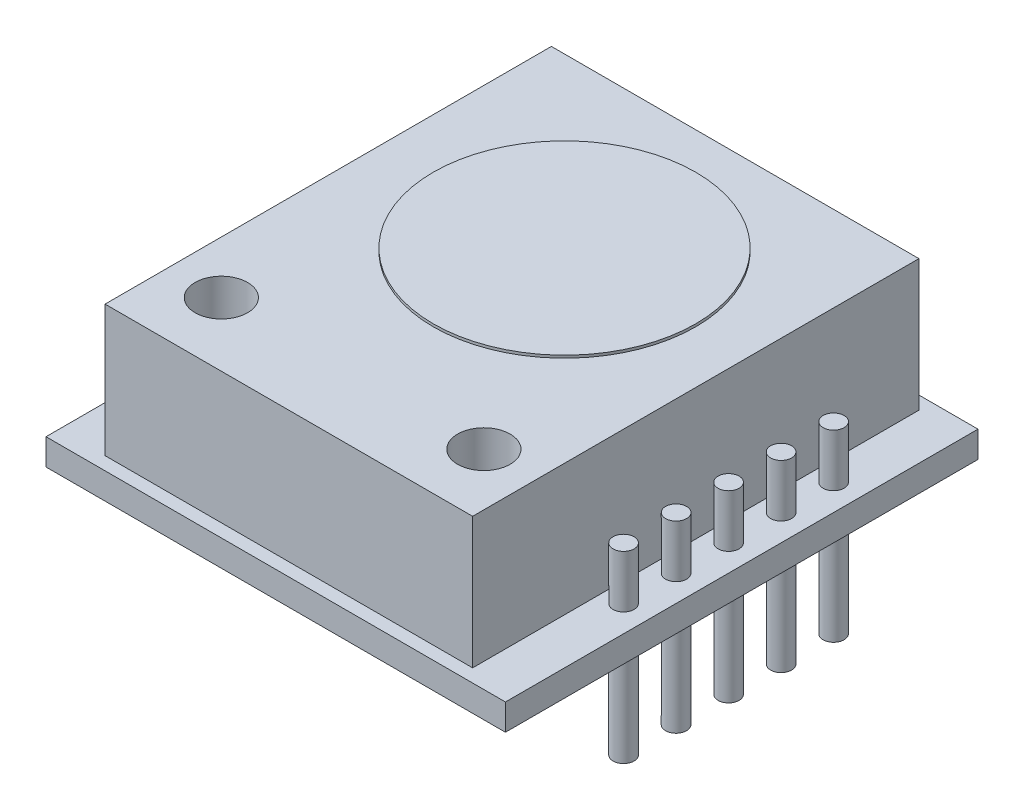
ISO-10303-21;
HEADER;
FILE_DESCRIPTION(('STEP AP214'),'2;1');
FILE_NAME('part.step','',(''),(''),'','','');
FILE_SCHEMA(('AUTOMOTIVE_DESIGN { 1 0 10303 214 1 1 1 1 }'));
ENDSEC;
DATA;
#1=APPLICATION_CONTEXT('core data for automotive mechanical design processes');
#2=APPLICATION_PROTOCOL_DEFINITION('international standard','automotive_design',2000,#1);
#3=PRODUCT_CONTEXT('',#1,'mechanical');
#4=PRODUCT('Part','Part','',(#3));
#5=PRODUCT_RELATED_PRODUCT_CATEGORY('part','',(#4));
#6=PRODUCT_DEFINITION_FORMATION('','',#4);
#7=PRODUCT_DEFINITION_CONTEXT('part definition',#1,'design');
#8=PRODUCT_DEFINITION('design','',#6,#7);
#9=PRODUCT_DEFINITION_SHAPE('','',#8);
#10=(LENGTH_UNIT() NAMED_UNIT(*) SI_UNIT(.MILLI.,.METRE.));
#11=(NAMED_UNIT(*) PLANE_ANGLE_UNIT() SI_UNIT($,.RADIAN.));
#12=(NAMED_UNIT(*) SI_UNIT($,.STERADIAN.) SOLID_ANGLE_UNIT());
#13=UNCERTAINTY_MEASURE_WITH_UNIT(LENGTH_MEASURE(1.E-05),#10,'distance_accuracy_value','');
#14=(GEOMETRIC_REPRESENTATION_CONTEXT(3) GLOBAL_UNCERTAINTY_ASSIGNED_CONTEXT((#13)) GLOBAL_UNIT_ASSIGNED_CONTEXT((#10,
#11,#12)) REPRESENTATION_CONTEXT('',''));
#15=CARTESIAN_POINT('',(0.,0.,0.));
#16=DIRECTION('',(0.,0.,1.));
#17=DIRECTION('',(1.,0.,0.));
#18=AXIS2_PLACEMENT_3D('',#15,#16,#17);
#19=CARTESIAN_POINT('',(0.,1.,0.));
#20=DIRECTION('',(0.,-1.,0.));
#21=DIRECTION('',(0.,0.,-1.));
#22=AXIS2_PLACEMENT_3D('',#19,#20,#21);
#23=PLANE('',#22);
#24=CARTESIAN_POINT('',(7.75000000000008,1.,3.5));
#25=DIRECTION('',(0.,-1.,0.));
#26=DIRECTION('',(0.,0.,-1.));
#27=AXIS2_PLACEMENT_3D('',#24,#25,#26);
#28=CIRCLE('',#27,0.4);
#29=CARTESIAN_POINT('',(7.75000000000008,1.,3.1));
#30=VERTEX_POINT('',#29);
#31=EDGE_CURVE('E714',#30,#30,#28,.T.);
#32=ORIENTED_EDGE('',*,*,#31,.T.);
#33=EDGE_LOOP('',(#32));
#34=FACE_BOUND('',#33,.T.);
#35=CARTESIAN_POINT('',(7.75000000000006,1.,1.5));
#36=DIRECTION('',(0.,-1.,0.));
#37=DIRECTION('',(0.,0.,-1.));
#38=AXIS2_PLACEMENT_3D('',#35,#36,#37);
#39=CIRCLE('',#38,0.4);
#40=CARTESIAN_POINT('',(7.75000000000006,1.,1.1));
#41=VERTEX_POINT('',#40);
#42=EDGE_CURVE('E722',#41,#41,#39,.T.);
#43=ORIENTED_EDGE('',*,*,#42,.T.);
#44=EDGE_LOOP('',(#43));
#45=FACE_BOUND('',#44,.T.);
#46=CARTESIAN_POINT('',(7.75000000000004,1.,-0.5));
#47=DIRECTION('',(0.,-1.,0.));
#48=DIRECTION('',(0.,0.,-1.));
#49=AXIS2_PLACEMENT_3D('',#46,#47,#48);
#50=CIRCLE('',#49,0.4);
#51=CARTESIAN_POINT('',(7.75000000000004,1.,-0.900000000000001));
#52=VERTEX_POINT('',#51);
#53=EDGE_CURVE('E731',#52,#52,#50,.T.);
#54=ORIENTED_EDGE('',*,*,#53,.T.);
#55=EDGE_LOOP('',(#54));
#56=FACE_BOUND('',#55,.T.);
#57=CARTESIAN_POINT('',(7.75000000000002,1.,-2.5));
#58=DIRECTION('',(0.,-1.,0.));
#59=DIRECTION('',(0.,0.,-1.));
#60=AXIS2_PLACEMENT_3D('',#57,#58,#59);
#61=CIRCLE('',#60,0.4);
#62=CARTESIAN_POINT('',(7.75000000000002,1.,-2.9));
#63=VERTEX_POINT('',#62);
#64=EDGE_CURVE('E740',#63,#63,#61,.T.);
#65=ORIENTED_EDGE('',*,*,#64,.T.);
#66=EDGE_LOOP('',(#65));
#67=FACE_BOUND('',#66,.T.);
#68=CARTESIAN_POINT('',(7.75,1.,-4.5));
#69=DIRECTION('',(0.,-1.,0.));
#70=DIRECTION('',(0.,0.,-1.));
#71=AXIS2_PLACEMENT_3D('',#68,#69,#70);
#72=CIRCLE('',#71,0.4);
#73=CARTESIAN_POINT('',(7.75,1.,-4.9));
#74=VERTEX_POINT('',#73);
#75=EDGE_CURVE('E279',#74,#74,#72,.T.);
#76=ORIENTED_EDGE('',*,*,#75,.T.);
#77=EDGE_LOOP('',(#76));
#78=FACE_BOUND('',#77,.T.);
#79=DIRECTION('',(0.,0.,-1.));
#80=VECTOR('',#79,1.);
#81=CARTESIAN_POINT('',(7.,1.,8.5));
#82=LINE('',#81,#80);
#83=CARTESIAN_POINT('',(7.,1.,8.5));
#84=VERTEX_POINT('',#83);
#85=CARTESIAN_POINT('',(7.,1.,-8.5));
#86=VERTEX_POINT('',#85);
#87=EDGE_CURVE('E51',#84,#86,#82,.T.);
#88=ORIENTED_EDGE('',*,*,#87,.F.);
#89=DIRECTION('',(1.,0.,0.));
#90=VECTOR('',#89,1.);
#91=CARTESIAN_POINT('',(-7.,1.,8.5));
#92=LINE('',#91,#90);
#93=CARTESIAN_POINT('',(-7.,1.,8.5));
#94=VERTEX_POINT('',#93);
#95=EDGE_CURVE('E55',#94,#84,#92,.T.);
#96=ORIENTED_EDGE('',*,*,#95,.F.);
#97=DIRECTION('',(0.,0.,1.));
#98=VECTOR('',#97,1.);
#99=CARTESIAN_POINT('',(-7.,1.,8.5));
#100=LINE('',#99,#98);
#101=CARTESIAN_POINT('',(-7.,1.,-8.5));
#102=VERTEX_POINT('',#101);
#103=EDGE_CURVE('E299',#102,#94,#100,.T.);
#104=ORIENTED_EDGE('',*,*,#103,.F.);
#105=DIRECTION('',(-1.,0.,0.));
#106=VECTOR('',#105,1.);
#107=CARTESIAN_POINT('',(-7.,1.,-8.5));
#108=LINE('',#107,#106);
#109=EDGE_CURVE('E297',#86,#102,#108,.T.);
#110=ORIENTED_EDGE('',*,*,#109,.F.);
#111=EDGE_LOOP('',(#88,#96,#104,#110));
#112=FACE_BOUND('',#111,.T.);
#113=DIRECTION('',(0.,0.,-1.));
#114=VECTOR('',#113,1.);
#115=CARTESIAN_POINT('',(8.75,1.,9.));
#116=LINE('',#115,#114);
#117=CARTESIAN_POINT('',(8.75,1.,9.));
#118=VERTEX_POINT('',#117);
#119=CARTESIAN_POINT('',(8.75,1.,-9.));
#120=VERTEX_POINT('',#119);
#121=EDGE_CURVE('E164',#118,#120,#116,.T.);
#122=ORIENTED_EDGE('',*,*,#121,.T.);
#123=DIRECTION('',(-1.,0.,0.));
#124=VECTOR('',#123,1.);
#125=CARTESIAN_POINT('',(-8.75,1.,-9.));
#126=LINE('',#125,#124);
#127=CARTESIAN_POINT('',(-8.75,1.,-9.));
#128=VERTEX_POINT('',#127);
#129=EDGE_CURVE('E167',#120,#128,#126,.T.);
#130=ORIENTED_EDGE('',*,*,#129,.T.);
#131=DIRECTION('',(0.,0.,1.));
#132=VECTOR('',#131,1.);
#133=CARTESIAN_POINT('',(-8.75,1.,9.));
#134=LINE('',#133,#132);
#135=CARTESIAN_POINT('',(-8.75,1.,9.));
#136=VERTEX_POINT('',#135);
#137=EDGE_CURVE('E170',#128,#136,#134,.T.);
#138=ORIENTED_EDGE('',*,*,#137,.T.);
#139=DIRECTION('',(1.,0.,0.));
#140=VECTOR('',#139,1.);
#141=CARTESIAN_POINT('',(-8.75,1.,9.));
#142=LINE('',#141,#140);
#143=EDGE_CURVE('E172',#136,#118,#142,.T.);
#144=ORIENTED_EDGE('',*,*,#143,.T.);
#145=EDGE_LOOP('',(#122,#130,#138,#144));
#146=FACE_BOUND('',#145,.T.);
#147=CARTESIAN_POINT('',(-7.95,1.,5.1));
#148=DIRECTION('',(0.,1.,0.));
#149=DIRECTION('',(0.,0.,1.));
#150=AXIS2_PLACEMENT_3D('',#147,#148,#149);
#151=CIRCLE('',#150,0.4);
#152=CARTESIAN_POINT('',(-7.95,1.,5.5));
#153=VERTEX_POINT('',#152);
#154=EDGE_CURVE('E158',#153,#153,#151,.T.);
#155=ORIENTED_EDGE('',*,*,#154,.F.);
#156=EDGE_LOOP('',(#155));
#157=FACE_BOUND('',#156,.T.);
#158=CARTESIAN_POINT('',(-7.95000000000001,1.,3.1));
#159=DIRECTION('',(0.,1.,0.));
#160=DIRECTION('',(0.,0.,1.));
#161=AXIS2_PLACEMENT_3D('',#158,#159,#160);
#162=CIRCLE('',#161,0.4);
#163=CARTESIAN_POINT('',(-7.95000000000001,1.,3.5));
#164=VERTEX_POINT('',#163);
#165=EDGE_CURVE('E152',#164,#164,#162,.T.);
#166=ORIENTED_EDGE('',*,*,#165,.F.);
#167=EDGE_LOOP('',(#166));
#168=FACE_BOUND('',#167,.T.);
#169=CARTESIAN_POINT('',(-7.95000000000001,1.,1.1));
#170=DIRECTION('',(0.,1.,0.));
#171=DIRECTION('',(0.,0.,1.));
#172=AXIS2_PLACEMENT_3D('',#169,#170,#171);
#173=CIRCLE('',#172,0.4);
#174=CARTESIAN_POINT('',(-7.95000000000001,1.,1.5));
#175=VERTEX_POINT('',#174);
#176=EDGE_CURVE('E146',#175,#175,#173,.T.);
#177=ORIENTED_EDGE('',*,*,#176,.F.);
#178=EDGE_LOOP('',(#177));
#179=FACE_BOUND('',#178,.T.);
#180=CARTESIAN_POINT('',(-7.95000000000002,1.,-0.900000000000002));
#181=DIRECTION('',(0.,1.,0.));
#182=DIRECTION('',(0.,0.,1.));
#183=AXIS2_PLACEMENT_3D('',#180,#181,#182);
#184=CIRCLE('',#183,0.4);
#185=CARTESIAN_POINT('',(-7.95000000000002,1.,-0.500000000000003));
#186=VERTEX_POINT('',#185);
#187=EDGE_CURVE('E140',#186,#186,#184,.T.);
#188=ORIENTED_EDGE('',*,*,#187,.F.);
#189=EDGE_LOOP('',(#188));
#190=FACE_BOUND('',#189,.T.);
#191=CARTESIAN_POINT('',(-7.95000000000003,1.,-2.9));
#192=DIRECTION('',(0.,1.,0.));
#193=DIRECTION('',(0.,0.,1.));
#194=AXIS2_PLACEMENT_3D('',#191,#192,#193);
#195=CIRCLE('',#194,0.4);
#196=CARTESIAN_POINT('',(-7.95000000000003,1.,-2.5));
#197=VERTEX_POINT('',#196);
#198=EDGE_CURVE('E134',#197,#197,#195,.T.);
#199=ORIENTED_EDGE('',*,*,#198,.F.);
#200=EDGE_LOOP('',(#199));
#201=FACE_BOUND('',#200,.T.);
#202=CARTESIAN_POINT('',(-7.95000000000003,1.,-4.9));
#203=DIRECTION('',(0.,1.,0.));
#204=DIRECTION('',(0.,0.,1.));
#205=AXIS2_PLACEMENT_3D('',#202,#203,#204);
#206=CIRCLE('',#205,0.4);
#207=CARTESIAN_POINT('',(-7.95000000000003,1.,-4.5));
#208=VERTEX_POINT('',#207);
#209=EDGE_CURVE('E125',#208,#208,#206,.T.);
#210=ORIENTED_EDGE('',*,*,#209,.F.);
#211=EDGE_LOOP('',(#210));
#212=FACE_BOUND('',#211,.T.);
#213=ADVANCED_FACE('F35',(#34,#45,#56,#67,#78,#112,#146,#157,#168,#179,#190,#201,#212),#23,.F.);
#214=CARTESIAN_POINT('',(0.,0.,0.));
#215=DIRECTION('',(0.,-1.,0.));
#216=DIRECTION('',(0.,0.,-1.));
#217=AXIS2_PLACEMENT_3D('',#214,#215,#216);
#218=PLANE('',#217);
#219=CARTESIAN_POINT('',(7.75000000000008,0.,3.5));
#220=DIRECTION('',(0.,-1.,0.));
#221=DIRECTION('',(0.,0.,-1.));
#222=AXIS2_PLACEMENT_3D('',#219,#220,#221);
#223=CIRCLE('',#222,0.4);
#224=CARTESIAN_POINT('',(7.75000000000008,0.,3.1));
#225=VERTEX_POINT('',#224);
#226=EDGE_CURVE('E39',#225,#225,#223,.T.);
#227=ORIENTED_EDGE('',*,*,#226,.F.);
#228=EDGE_LOOP('',(#227));
#229=FACE_BOUND('',#228,.T.);
#230=CARTESIAN_POINT('',(7.75000000000006,0.,1.5));
#231=DIRECTION('',(0.,-1.,0.));
#232=DIRECTION('',(0.,0.,-1.));
#233=AXIS2_PLACEMENT_3D('',#230,#231,#232);
#234=CIRCLE('',#233,0.4);
#235=CARTESIAN_POINT('',(7.75000000000006,0.,1.1));
#236=VERTEX_POINT('',#235);
#237=EDGE_CURVE('E201',#236,#236,#234,.T.);
#238=ORIENTED_EDGE('',*,*,#237,.F.);
#239=EDGE_LOOP('',(#238));
#240=FACE_BOUND('',#239,.T.);
#241=CARTESIAN_POINT('',(7.75000000000004,0.,-0.5));
#242=DIRECTION('',(0.,-1.,0.));
#243=DIRECTION('',(0.,0.,-1.));
#244=AXIS2_PLACEMENT_3D('',#241,#242,#243);
#245=CIRCLE('',#244,0.4);
#246=CARTESIAN_POINT('',(7.75000000000004,0.,-0.900000000000001));
#247=VERTEX_POINT('',#246);
#248=EDGE_CURVE('E199',#247,#247,#245,.T.);
#249=ORIENTED_EDGE('',*,*,#248,.F.);
#250=EDGE_LOOP('',(#249));
#251=FACE_BOUND('',#250,.T.);
#252=CARTESIAN_POINT('',(7.75000000000002,0.,-2.5));
#253=DIRECTION('',(0.,-1.,0.));
#254=DIRECTION('',(0.,0.,-1.));
#255=AXIS2_PLACEMENT_3D('',#252,#253,#254);
#256=CIRCLE('',#255,0.4);
#257=CARTESIAN_POINT('',(7.75000000000002,0.,-2.9));
#258=VERTEX_POINT('',#257);
#259=EDGE_CURVE('E196',#258,#258,#256,.T.);
#260=ORIENTED_EDGE('',*,*,#259,.F.);
#261=EDGE_LOOP('',(#260));
#262=FACE_BOUND('',#261,.T.);
#263=CARTESIAN_POINT('',(7.75,0.,-4.5));
#264=DIRECTION('',(0.,-1.,0.));
#265=DIRECTION('',(0.,0.,-1.));
#266=AXIS2_PLACEMENT_3D('',#263,#264,#265);
#267=CIRCLE('',#266,0.4);
#268=CARTESIAN_POINT('',(7.75,0.,-4.9));
#269=VERTEX_POINT('',#268);
#270=EDGE_CURVE('E193',#269,#269,#267,.T.);
#271=ORIENTED_EDGE('',*,*,#270,.F.);
#272=EDGE_LOOP('',(#271));
#273=FACE_BOUND('',#272,.T.);
#274=CARTESIAN_POINT('',(-7.95000000000003,0.,-2.9));
#275=DIRECTION('',(0.,1.,0.));
#276=DIRECTION('',(0.,0.,1.));
#277=AXIS2_PLACEMENT_3D('',#274,#275,#276);
#278=CIRCLE('',#277,0.4);
#279=CARTESIAN_POINT('',(-7.95000000000003,0.,-2.5));
#280=VERTEX_POINT('',#279);
#281=EDGE_CURVE('E132',#280,#280,#278,.T.);
#282=ORIENTED_EDGE('',*,*,#281,.T.);
#283=EDGE_LOOP('',(#282));
#284=FACE_BOUND('',#283,.T.);
#285=CARTESIAN_POINT('',(-7.95000000000001,0.,1.1));
#286=DIRECTION('',(0.,1.,0.));
#287=DIRECTION('',(0.,0.,1.));
#288=AXIS2_PLACEMENT_3D('',#285,#286,#287);
#289=CIRCLE('',#288,0.4);
#290=CARTESIAN_POINT('',(-7.95000000000001,0.,1.5));
#291=VERTEX_POINT('',#290);
#292=EDGE_CURVE('E143',#291,#291,#289,.T.);
#293=ORIENTED_EDGE('',*,*,#292,.T.);
#294=EDGE_LOOP('',(#293));
#295=FACE_BOUND('',#294,.T.);
#296=CARTESIAN_POINT('',(-7.95,0.,5.1));
#297=DIRECTION('',(0.,1.,0.));
#298=DIRECTION('',(0.,0.,1.));
#299=AXIS2_PLACEMENT_3D('',#296,#297,#298);
#300=CIRCLE('',#299,0.4);
#301=CARTESIAN_POINT('',(-7.95,0.,5.5));
#302=VERTEX_POINT('',#301);
#303=EDGE_CURVE('E155',#302,#302,#300,.T.);
#304=ORIENTED_EDGE('',*,*,#303,.T.);
#305=EDGE_LOOP('',(#304));
#306=FACE_BOUND('',#305,.T.);
#307=DIRECTION('',(0.,0.,-1.));
#308=VECTOR('',#307,1.);
#309=CARTESIAN_POINT('',(8.75,0.,9.));
#310=LINE('',#309,#308);
#311=CARTESIAN_POINT('',(8.75,0.,9.));
#312=VERTEX_POINT('',#311);
#313=CARTESIAN_POINT('',(8.75,0.,-9.));
#314=VERTEX_POINT('',#313);
#315=EDGE_CURVE('E161',#312,#314,#310,.T.);
#316=ORIENTED_EDGE('',*,*,#315,.F.);
#317=DIRECTION('',(1.,0.,0.));
#318=VECTOR('',#317,1.);
#319=CARTESIAN_POINT('',(-8.75,0.,9.));
#320=LINE('',#319,#318);
#321=CARTESIAN_POINT('',(-8.75,0.,9.));
#322=VERTEX_POINT('',#321);
#323=EDGE_CURVE('E168',#322,#312,#320,.T.);
#324=ORIENTED_EDGE('',*,*,#323,.F.);
#325=DIRECTION('',(0.,0.,1.));
#326=VECTOR('',#325,1.);
#327=CARTESIAN_POINT('',(-8.75,0.,9.));
#328=LINE('',#327,#326);
#329=CARTESIAN_POINT('',(-8.75,0.,-9.));
#330=VERTEX_POINT('',#329);
#331=EDGE_CURVE('E179',#330,#322,#328,.T.);
#332=ORIENTED_EDGE('',*,*,#331,.F.);
#333=DIRECTION('',(-1.,0.,0.));
#334=VECTOR('',#333,1.);
#335=CARTESIAN_POINT('',(-8.75,0.,-9.));
#336=LINE('',#335,#334);
#337=EDGE_CURVE('E177',#314,#330,#336,.T.);
#338=ORIENTED_EDGE('',*,*,#337,.F.);
#339=EDGE_LOOP('',(#316,#324,#332,#338));
#340=FACE_BOUND('',#339,.T.);
#341=CARTESIAN_POINT('',(-7.95000000000001,0.,3.1));
#342=DIRECTION('',(0.,1.,0.));
#343=DIRECTION('',(0.,0.,1.));
#344=AXIS2_PLACEMENT_3D('',#341,#342,#343);
#345=CIRCLE('',#344,0.4);
#346=CARTESIAN_POINT('',(-7.95000000000001,0.,3.5));
#347=VERTEX_POINT('',#346);
#348=EDGE_CURVE('E149',#347,#347,#345,.T.);
#349=ORIENTED_EDGE('',*,*,#348,.T.);
#350=EDGE_LOOP('',(#349));
#351=FACE_BOUND('',#350,.T.);
#352=CARTESIAN_POINT('',(-7.95000000000002,0.,-0.900000000000002));
#353=DIRECTION('',(0.,1.,0.));
#354=DIRECTION('',(0.,0.,1.));
#355=AXIS2_PLACEMENT_3D('',#352,#353,#354);
#356=CIRCLE('',#355,0.4);
#357=CARTESIAN_POINT('',(-7.95000000000002,0.,-0.500000000000003));
#358=VERTEX_POINT('',#357);
#359=EDGE_CURVE('E137',#358,#358,#356,.T.);
#360=ORIENTED_EDGE('',*,*,#359,.T.);
#361=EDGE_LOOP('',(#360));
#362=FACE_BOUND('',#361,.T.);
#363=CARTESIAN_POINT('',(-7.95000000000003,0.,-4.9));
#364=DIRECTION('',(0.,1.,0.));
#365=DIRECTION('',(0.,0.,1.));
#366=AXIS2_PLACEMENT_3D('',#363,#364,#365);
#367=CIRCLE('',#366,0.4);
#368=CARTESIAN_POINT('',(-7.95000000000003,0.,-4.5));
#369=VERTEX_POINT('',#368);
#370=EDGE_CURVE('E122',#369,#369,#367,.T.);
#371=ORIENTED_EDGE('',*,*,#370,.T.);
#372=EDGE_LOOP('',(#371));
#373=FACE_BOUND('',#372,.T.);
#374=ADVANCED_FACE('F211',(#229,#240,#251,#262,#273,#284,#295,#306,#340,#351,#362,#373),#218,.T.);
#375=CARTESIAN_POINT('',(8.75,1.,9.));
#376=DIRECTION('',(-1.,0.,0.));
#377=DIRECTION('',(0.,0.,1.));
#378=AXIS2_PLACEMENT_3D('',#375,#376,#377);
#379=PLANE('',#378);
#380=ORIENTED_EDGE('',*,*,#315,.T.);
#381=DIRECTION('',(0.,-1.,0.));
#382=VECTOR('',#381,1.);
#383=CARTESIAN_POINT('',(8.75,1.,-9.));
#384=LINE('',#383,#382);
#385=EDGE_CURVE('E190',#120,#314,#384,.T.);
#386=ORIENTED_EDGE('',*,*,#385,.F.);
#387=ORIENTED_EDGE('',*,*,#121,.F.);
#388=DIRECTION('',(0.,-1.,0.));
#389=VECTOR('',#388,1.);
#390=CARTESIAN_POINT('',(8.75,1.,9.));
#391=LINE('',#390,#389);
#392=EDGE_CURVE('E174',#118,#312,#391,.T.);
#393=ORIENTED_EDGE('',*,*,#392,.T.);
#394=EDGE_LOOP('',(#380,#386,#387,#393));
#395=FACE_BOUND('',#394,.T.);
#396=ADVANCED_FACE('F37',(#395),#379,.F.);
#397=CARTESIAN_POINT('',(-8.75,1.,-9.));
#398=DIRECTION('',(0.,0.,1.));
#399=DIRECTION('',(1.,0.,0.));
#400=AXIS2_PLACEMENT_3D('',#397,#398,#399);
#401=PLANE('',#400);
#402=ORIENTED_EDGE('',*,*,#337,.T.);
#403=DIRECTION('',(0.,-1.,0.));
#404=VECTOR('',#403,1.);
#405=CARTESIAN_POINT('',(-8.75,1.,-9.));
#406=LINE('',#405,#404);
#407=EDGE_CURVE('E187',#128,#330,#406,.T.);
#408=ORIENTED_EDGE('',*,*,#407,.F.);
#409=ORIENTED_EDGE('',*,*,#129,.F.);
#410=ORIENTED_EDGE('',*,*,#385,.T.);
#411=EDGE_LOOP('',(#402,#408,#409,#410));
#412=FACE_BOUND('',#411,.T.);
#413=ADVANCED_FACE('F352',(#412),#401,.F.);
#414=CARTESIAN_POINT('',(-8.75,1.,9.));
#415=DIRECTION('',(1.,0.,0.));
#416=DIRECTION('',(0.,0.,-1.));
#417=AXIS2_PLACEMENT_3D('',#414,#415,#416);
#418=PLANE('',#417);
#419=ORIENTED_EDGE('',*,*,#331,.T.);
#420=DIRECTION('',(0.,-1.,0.));
#421=VECTOR('',#420,1.);
#422=CARTESIAN_POINT('',(-8.75,1.,9.));
#423=LINE('',#422,#421);
#424=EDGE_CURVE('E184',#136,#322,#423,.T.);
#425=ORIENTED_EDGE('',*,*,#424,.F.);
#426=ORIENTED_EDGE('',*,*,#137,.F.);
#427=ORIENTED_EDGE('',*,*,#407,.T.);
#428=EDGE_LOOP('',(#419,#425,#426,#427));
#429=FACE_BOUND('',#428,.T.);
#430=ADVANCED_FACE('F345',(#429),#418,.F.);
#431=CARTESIAN_POINT('',(-8.75,1.,9.));
#432=DIRECTION('',(0.,0.,-1.));
#433=DIRECTION('',(-1.,0.,0.));
#434=AXIS2_PLACEMENT_3D('',#431,#432,#433);
#435=PLANE('',#434);
#436=ORIENTED_EDGE('',*,*,#323,.T.);
#437=ORIENTED_EDGE('',*,*,#392,.F.);
#438=ORIENTED_EDGE('',*,*,#143,.F.);
#439=ORIENTED_EDGE('',*,*,#424,.T.);
#440=EDGE_LOOP('',(#436,#437,#438,#439));
#441=FACE_BOUND('',#440,.T.);
#442=ADVANCED_FACE('F340',(#441),#435,.F.);
#443=CARTESIAN_POINT('',(-7.95,1.,5.1));
#444=DIRECTION('',(0.,-1.,0.));
#445=DIRECTION('',(0.,0.,-1.));
#446=AXIS2_PLACEMENT_3D('',#443,#444,#445);
#447=CYLINDRICAL_SURFACE('',#446,0.4);
#448=ORIENTED_EDGE('',*,*,#154,.T.);
#449=EDGE_LOOP('',(#448));
#450=FACE_BOUND('',#449,.T.);
#451=ORIENTED_EDGE('',*,*,#303,.F.);
#452=EDGE_LOOP('',(#451));
#453=FACE_BOUND('',#452,.T.);
#454=ADVANCED_FACE('F337',(#450,#453),#447,.F.);
#455=CARTESIAN_POINT('',(-7.95000000000001,1.,3.1));
#456=DIRECTION('',(0.,-1.,0.));
#457=DIRECTION('',(0.,0.,-1.));
#458=AXIS2_PLACEMENT_3D('',#455,#456,#457);
#459=CYLINDRICAL_SURFACE('',#458,0.4);
#460=ORIENTED_EDGE('',*,*,#165,.T.);
#461=EDGE_LOOP('',(#460));
#462=FACE_BOUND('',#461,.T.);
#463=ORIENTED_EDGE('',*,*,#348,.F.);
#464=EDGE_LOOP('',(#463));
#465=FACE_BOUND('',#464,.T.);
#466=ADVANCED_FACE('F332',(#462,#465),#459,.F.);
#467=CARTESIAN_POINT('',(-7.95000000000001,1.,1.1));
#468=DIRECTION('',(0.,-1.,0.));
#469=DIRECTION('',(0.,0.,-1.));
#470=AXIS2_PLACEMENT_3D('',#467,#468,#469);
#471=CYLINDRICAL_SURFACE('',#470,0.4);
#472=ORIENTED_EDGE('',*,*,#176,.T.);
#473=EDGE_LOOP('',(#472));
#474=FACE_BOUND('',#473,.T.);
#475=ORIENTED_EDGE('',*,*,#292,.F.);
#476=EDGE_LOOP('',(#475));
#477=FACE_BOUND('',#476,.T.);
#478=ADVANCED_FACE('F327',(#474,#477),#471,.F.);
#479=CARTESIAN_POINT('',(-7.95000000000002,1.,-0.900000000000002));
#480=DIRECTION('',(0.,-1.,0.));
#481=DIRECTION('',(0.,0.,-1.));
#482=AXIS2_PLACEMENT_3D('',#479,#480,#481);
#483=CYLINDRICAL_SURFACE('',#482,0.4);
#484=ORIENTED_EDGE('',*,*,#187,.T.);
#485=EDGE_LOOP('',(#484));
#486=FACE_BOUND('',#485,.T.);
#487=ORIENTED_EDGE('',*,*,#359,.F.);
#488=EDGE_LOOP('',(#487));
#489=FACE_BOUND('',#488,.T.);
#490=ADVANCED_FACE('F248',(#486,#489),#483,.F.);
#491=CARTESIAN_POINT('',(-7.95000000000003,1.,-2.9));
#492=DIRECTION('',(0.,-1.,0.));
#493=DIRECTION('',(0.,0.,-1.));
#494=AXIS2_PLACEMENT_3D('',#491,#492,#493);
#495=CYLINDRICAL_SURFACE('',#494,0.4);
#496=ORIENTED_EDGE('',*,*,#198,.T.);
#497=EDGE_LOOP('',(#496));
#498=FACE_BOUND('',#497,.T.);
#499=ORIENTED_EDGE('',*,*,#281,.F.);
#500=EDGE_LOOP('',(#499));
#501=FACE_BOUND('',#500,.T.);
#502=ADVANCED_FACE('F239',(#498,#501),#495,.F.);
#503=CARTESIAN_POINT('',(-7.95000000000003,1.,-4.9));
#504=DIRECTION('',(0.,-1.,0.));
#505=DIRECTION('',(0.,0.,-1.));
#506=AXIS2_PLACEMENT_3D('',#503,#504,#505);
#507=CYLINDRICAL_SURFACE('',#506,0.4);
#508=ORIENTED_EDGE('',*,*,#209,.T.);
#509=EDGE_LOOP('',(#508));
#510=FACE_BOUND('',#509,.T.);
#511=ORIENTED_EDGE('',*,*,#370,.F.);
#512=EDGE_LOOP('',(#511));
#513=FACE_BOUND('',#512,.T.);
#514=ADVANCED_FACE('F237',(#510,#513),#507,.F.);
#515=CARTESIAN_POINT('',(0.,6.,0.));
#516=DIRECTION('',(0.,-1.,0.));
#517=DIRECTION('',(0.,0.,-1.));
#518=AXIS2_PLACEMENT_3D('',#515,#516,#517);
#519=PLANE('',#518);
#520=CARTESIAN_POINT('',(0.,6.,-2.));
#521=DIRECTION('',(0.,1.,0.));
#522=DIRECTION('',(0.,0.,1.));
#523=AXIS2_PLACEMENT_3D('',#520,#521,#522);
#524=CIRCLE('',#523,5.);
#525=CARTESIAN_POINT('',(0.,6.,3.));
#526=VERTEX_POINT('',#525);
#527=EDGE_CURVE('E11',#526,#526,#524,.T.);
#528=ORIENTED_EDGE('',*,*,#527,.F.);
#529=EDGE_LOOP('',(#528));
#530=FACE_BOUND('',#529,.T.);
#531=DIRECTION('',(0.,0.,-1.));
#532=VECTOR('',#531,1.);
#533=CARTESIAN_POINT('',(7.,6.,8.5));
#534=LINE('',#533,#532);
#535=CARTESIAN_POINT('',(7.,6.,8.5));
#536=VERTEX_POINT('',#535);
#537=CARTESIAN_POINT('',(7.,6.,-8.5));
#538=VERTEX_POINT('',#537);
#539=EDGE_CURVE('E110',#536,#538,#534,.T.);
#540=ORIENTED_EDGE('',*,*,#539,.T.);
#541=DIRECTION('',(-1.,0.,0.));
#542=VECTOR('',#541,1.);
#543=CARTESIAN_POINT('',(-7.,6.,-8.5));
#544=LINE('',#543,#542);
#545=CARTESIAN_POINT('',(-7.,6.,-8.5));
#546=VERTEX_POINT('',#545);
#547=EDGE_CURVE('E99',#538,#546,#544,.T.);
#548=ORIENTED_EDGE('',*,*,#547,.T.);
#549=DIRECTION('',(0.,0.,1.));
#550=VECTOR('',#549,1.);
#551=CARTESIAN_POINT('',(-7.,6.,8.5));
#552=LINE('',#551,#550);
#553=CARTESIAN_POINT('',(-7.,6.,8.5));
#554=VERTEX_POINT('',#553);
#555=EDGE_CURVE('E109',#546,#554,#552,.T.);
#556=ORIENTED_EDGE('',*,*,#555,.T.);
#557=DIRECTION('',(1.,0.,0.));
#558=VECTOR('',#557,1.);
#559=CARTESIAN_POINT('',(-7.,6.,8.5));
#560=LINE('',#559,#558);
#561=EDGE_CURVE('E116',#554,#536,#560,.T.);
#562=ORIENTED_EDGE('',*,*,#561,.T.);
#563=EDGE_LOOP('',(#540,#548,#556,#562));
#564=FACE_BOUND('',#563,.T.);
#565=CARTESIAN_POINT('',(-5.,6.,6.07142857142857));
#566=DIRECTION('',(0.,1.,0.));
#567=DIRECTION('',(0.,0.,1.));
#568=AXIS2_PLACEMENT_3D('',#565,#566,#567);
#569=CIRCLE('',#568,1.);
#570=CARTESIAN_POINT('',(-5.,6.,7.07142857142857));
#571=VERTEX_POINT('',#570);
#572=EDGE_CURVE('E288',#571,#571,#569,.T.);
#573=ORIENTED_EDGE('',*,*,#572,.F.);
#574=EDGE_LOOP('',(#573));
#575=FACE_BOUND('',#574,.T.);
#576=CARTESIAN_POINT('',(5.,6.,6.07142857142858));
#577=DIRECTION('',(0.,1.,0.));
#578=DIRECTION('',(0.,0.,1.));
#579=AXIS2_PLACEMENT_3D('',#576,#577,#578);
#580=CIRCLE('',#579,1.);
#581=CARTESIAN_POINT('',(5.,6.,7.07142857142858));
#582=VERTEX_POINT('',#581);
#583=EDGE_CURVE('E278',#582,#582,#580,.T.);
#584=ORIENTED_EDGE('',*,*,#583,.F.);
#585=EDGE_LOOP('',(#584));
#586=FACE_BOUND('',#585,.T.);
#587=ADVANCED_FACE('F113',(#530,#564,#575,#586),#519,.F.);
#588=CARTESIAN_POINT('',(7.,6.,8.5));
#589=DIRECTION('',(-1.,0.,0.));
#590=DIRECTION('',(0.,0.,1.));
#591=AXIS2_PLACEMENT_3D('',#588,#589,#590);
#592=PLANE('',#591);
#593=ORIENTED_EDGE('',*,*,#87,.T.);
#594=DIRECTION('',(0.,-1.,0.));
#595=VECTOR('',#594,1.);
#596=CARTESIAN_POINT('',(7.,6.,-8.5));
#597=LINE('',#596,#595);
#598=EDGE_CURVE('E104',#538,#86,#597,.T.);
#599=ORIENTED_EDGE('',*,*,#598,.F.);
#600=ORIENTED_EDGE('',*,*,#539,.F.);
#601=DIRECTION('',(0.,-1.,0.));
#602=VECTOR('',#601,1.);
#603=CARTESIAN_POINT('',(7.,6.,8.5));
#604=LINE('',#603,#602);
#605=EDGE_CURVE('E295',#536,#84,#604,.T.);
#606=ORIENTED_EDGE('',*,*,#605,.T.);
#607=EDGE_LOOP('',(#593,#599,#600,#606));
#608=FACE_BOUND('',#607,.T.);
#609=ADVANCED_FACE('F121',(#608),#592,.F.);
#610=CARTESIAN_POINT('',(-7.,6.,-8.5));
#611=DIRECTION('',(0.,0.,1.));
#612=DIRECTION('',(1.,0.,0.));
#613=AXIS2_PLACEMENT_3D('',#610,#611,#612);
#614=PLANE('',#613);
#615=ORIENTED_EDGE('',*,*,#109,.T.);
#616=DIRECTION('',(0.,-1.,0.));
#617=VECTOR('',#616,1.);
#618=CARTESIAN_POINT('',(-7.,6.,-8.5));
#619=LINE('',#618,#617);
#620=EDGE_CURVE('E106',#546,#102,#619,.T.);
#621=ORIENTED_EDGE('',*,*,#620,.F.);
#622=ORIENTED_EDGE('',*,*,#547,.F.);
#623=ORIENTED_EDGE('',*,*,#598,.T.);
#624=EDGE_LOOP('',(#615,#621,#622,#623));
#625=FACE_BOUND('',#624,.T.);
#626=ADVANCED_FACE('F102',(#625),#614,.F.);
#627=CARTESIAN_POINT('',(-7.,6.,8.5));
#628=DIRECTION('',(1.,0.,0.));
#629=DIRECTION('',(0.,0.,-1.));
#630=AXIS2_PLACEMENT_3D('',#627,#628,#629);
#631=PLANE('',#630);
#632=ORIENTED_EDGE('',*,*,#103,.T.);
#633=DIRECTION('',(0.,-1.,0.));
#634=VECTOR('',#633,1.);
#635=CARTESIAN_POINT('',(-7.,6.,8.5));
#636=LINE('',#635,#634);
#637=EDGE_CURVE('E127',#554,#94,#636,.T.);
#638=ORIENTED_EDGE('',*,*,#637,.F.);
#639=ORIENTED_EDGE('',*,*,#555,.F.);
#640=ORIENTED_EDGE('',*,*,#620,.T.);
#641=EDGE_LOOP('',(#632,#638,#639,#640));
#642=FACE_BOUND('',#641,.T.);
#643=ADVANCED_FACE('F307',(#642),#631,.F.);
#644=CARTESIAN_POINT('',(-7.,6.,8.5));
#645=DIRECTION('',(0.,0.,-1.));
#646=DIRECTION('',(-1.,0.,0.));
#647=AXIS2_PLACEMENT_3D('',#644,#645,#646);
#648=PLANE('',#647);
#649=ORIENTED_EDGE('',*,*,#95,.T.);
#650=ORIENTED_EDGE('',*,*,#605,.F.);
#651=ORIENTED_EDGE('',*,*,#561,.F.);
#652=ORIENTED_EDGE('',*,*,#637,.T.);
#653=EDGE_LOOP('',(#649,#650,#651,#652));
#654=FACE_BOUND('',#653,.T.);
#655=ADVANCED_FACE('F305',(#654),#648,.F.);
#656=CARTESIAN_POINT('',(-5.,6.,6.07142857142857));
#657=DIRECTION('',(0.,-1.,0.));
#658=DIRECTION('',(0.,0.,-1.));
#659=AXIS2_PLACEMENT_3D('',#656,#657,#658);
#660=CYLINDRICAL_SURFACE('',#659,1.);
#661=ORIENTED_EDGE('',*,*,#572,.T.);
#662=EDGE_LOOP('',(#661));
#663=FACE_BOUND('',#662,.T.);
#664=CARTESIAN_POINT('',(-5.,1.,6.07142857142857));
#665=DIRECTION('',(0.,1.,0.));
#666=DIRECTION('',(0.,0.,1.));
#667=AXIS2_PLACEMENT_3D('',#664,#665,#666);
#668=CIRCLE('',#667,1.);
#669=CARTESIAN_POINT('',(-5.,1.,7.07142857142857));
#670=VERTEX_POINT('',#669);
#671=EDGE_CURVE('E282',#670,#670,#668,.T.);
#672=ORIENTED_EDGE('',*,*,#671,.F.);
#673=EDGE_LOOP('',(#672));
#674=FACE_BOUND('',#673,.T.);
#675=ADVANCED_FACE('F600',(#663,#674),#660,.F.);
#676=CARTESIAN_POINT('',(5.,6.,6.07142857142858));
#677=DIRECTION('',(0.,-1.,0.));
#678=DIRECTION('',(0.,0.,-1.));
#679=AXIS2_PLACEMENT_3D('',#676,#677,#678);
#680=CYLINDRICAL_SURFACE('',#679,1.);
#681=ORIENTED_EDGE('',*,*,#583,.T.);
#682=EDGE_LOOP('',(#681));
#683=FACE_BOUND('',#682,.T.);
#684=CARTESIAN_POINT('',(5.,1.,6.07142857142858));
#685=DIRECTION('',(0.,1.,0.));
#686=DIRECTION('',(0.,0.,1.));
#687=AXIS2_PLACEMENT_3D('',#684,#685,#686);
#688=CIRCLE('',#687,1.);
#689=CARTESIAN_POINT('',(5.,1.,7.07142857142858));
#690=VERTEX_POINT('',#689);
#691=EDGE_CURVE('E276',#690,#690,#688,.T.);
#692=ORIENTED_EDGE('',*,*,#691,.F.);
#693=EDGE_LOOP('',(#692));
#694=FACE_BOUND('',#693,.T.);
#695=ADVANCED_FACE('F263',(#683,#694),#680,.F.);
#696=ORIENTED_EDGE('',*,*,#671,.T.);
#697=EDGE_LOOP('',(#696));
#698=FACE_BOUND('',#697,.T.);
#699=ADVANCED_FACE('F255',(#698),#23,.F.);
#700=ORIENTED_EDGE('',*,*,#691,.T.);
#701=EDGE_LOOP('',(#700));
#702=FACE_BOUND('',#701,.T.);
#703=ADVANCED_FACE('F256',(#702),#23,.F.);
#704=CARTESIAN_POINT('',(7.75,-4.,-4.5));
#705=DIRECTION('',(0.,1.,0.));
#706=DIRECTION('',(0.,0.,1.));
#707=AXIS2_PLACEMENT_3D('',#704,#705,#706);
#708=PLANE('',#707);
#709=CARTESIAN_POINT('',(7.75,-4.,-4.5));
#710=DIRECTION('',(0.,1.,0.));
#711=DIRECTION('',(0.,0.,1.));
#712=AXIS2_PLACEMENT_3D('',#709,#710,#711);
#713=CIRCLE('',#712,0.4);
#714=CARTESIAN_POINT('',(7.75,-4.,-4.1));
#715=VERTEX_POINT('',#714);
#716=EDGE_CURVE('E285',#715,#715,#713,.T.);
#717=ORIENTED_EDGE('',*,*,#716,.F.);
#718=EDGE_LOOP('',(#717));
#719=FACE_BOUND('',#718,.T.);
#720=ADVANCED_FACE('F266',(#719),#708,.F.);
#721=CARTESIAN_POINT('',(7.75,-4.,-4.5));
#722=DIRECTION('',(0.,1.,0.));
#723=DIRECTION('',(0.,0.,1.));
#724=AXIS2_PLACEMENT_3D('',#721,#722,#723);
#725=CYLINDRICAL_SURFACE('',#724,0.4);
#726=ORIENTED_EDGE('',*,*,#270,.T.);
#727=EDGE_LOOP('',(#726));
#728=FACE_BOUND('',#727,.T.);
#729=ORIENTED_EDGE('',*,*,#716,.T.);
#730=EDGE_LOOP('',(#729));
#731=FACE_BOUND('',#730,.T.);
#732=ADVANCED_FACE('F271',(#728,#731),#725,.T.);
#733=CARTESIAN_POINT('',(7.75,3.,-4.5));
#734=DIRECTION('',(0.,1.,0.));
#735=DIRECTION('',(0.,0.,1.));
#736=AXIS2_PLACEMENT_3D('',#733,#734,#735);
#737=CIRCLE('',#736,0.4);
#738=CARTESIAN_POINT('',(7.75,3.,-4.1));
#739=VERTEX_POINT('',#738);
#740=EDGE_CURVE('E743',#739,#739,#737,.T.);
#741=ORIENTED_EDGE('',*,*,#740,.F.);
#742=EDGE_LOOP('',(#741));
#743=FACE_BOUND('',#742,.T.);
#744=ORIENTED_EDGE('',*,*,#75,.F.);
#745=EDGE_LOOP('',(#744));
#746=FACE_BOUND('',#745,.T.);
#747=ADVANCED_FACE('F391',(#743,#746),#725,.T.);
#748=CARTESIAN_POINT('',(7.75,3.,-4.5));
#749=DIRECTION('',(0.,1.,0.));
#750=DIRECTION('',(0.,0.,1.));
#751=AXIS2_PLACEMENT_3D('',#748,#749,#750);
#752=PLANE('',#751);
#753=ORIENTED_EDGE('',*,*,#740,.T.);
#754=EDGE_LOOP('',(#753));
#755=FACE_BOUND('',#754,.T.);
#756=ADVANCED_FACE('F401',(#755),#752,.T.);
#757=CARTESIAN_POINT('',(7.75000000000002,-4.,-2.5));
#758=DIRECTION('',(0.,1.,0.));
#759=DIRECTION('',(0.,0.,1.));
#760=AXIS2_PLACEMENT_3D('',#757,#758,#759);
#761=PLANE('',#760);
#762=CARTESIAN_POINT('',(7.75000000000002,-4.,-2.5));
#763=DIRECTION('',(0.,1.,0.));
#764=DIRECTION('',(0.,0.,1.));
#765=AXIS2_PLACEMENT_3D('',#762,#763,#764);
#766=CIRCLE('',#765,0.4);
#767=CARTESIAN_POINT('',(7.75000000000002,-4.,-2.1));
#768=VERTEX_POINT('',#767);
#769=EDGE_CURVE('E737',#768,#768,#766,.T.);
#770=ORIENTED_EDGE('',*,*,#769,.F.);
#771=EDGE_LOOP('',(#770));
#772=FACE_BOUND('',#771,.T.);
#773=ADVANCED_FACE('F410',(#772),#761,.F.);
#774=CARTESIAN_POINT('',(7.75000000000002,-4.,-2.5));
#775=DIRECTION('',(0.,1.,0.));
#776=DIRECTION('',(0.,0.,1.));
#777=AXIS2_PLACEMENT_3D('',#774,#775,#776);
#778=CYLINDRICAL_SURFACE('',#777,0.4);
#779=ORIENTED_EDGE('',*,*,#259,.T.);
#780=EDGE_LOOP('',(#779));
#781=FACE_BOUND('',#780,.T.);
#782=ORIENTED_EDGE('',*,*,#769,.T.);
#783=EDGE_LOOP('',(#782));
#784=FACE_BOUND('',#783,.T.);
#785=ADVANCED_FACE('F420',(#781,#784),#778,.T.);
#786=CARTESIAN_POINT('',(7.75000000000002,3.,-2.5));
#787=DIRECTION('',(0.,1.,0.));
#788=DIRECTION('',(0.,0.,1.));
#789=AXIS2_PLACEMENT_3D('',#786,#787,#788);
#790=CIRCLE('',#789,0.4);
#791=CARTESIAN_POINT('',(7.75000000000002,3.,-2.1));
#792=VERTEX_POINT('',#791);
#793=EDGE_CURVE('E734',#792,#792,#790,.T.);
#794=ORIENTED_EDGE('',*,*,#793,.F.);
#795=EDGE_LOOP('',(#794));
#796=FACE_BOUND('',#795,.T.);
#797=ORIENTED_EDGE('',*,*,#64,.F.);
#798=EDGE_LOOP('',(#797));
#799=FACE_BOUND('',#798,.T.);
#800=ADVANCED_FACE('F430',(#796,#799),#778,.T.);
#801=CARTESIAN_POINT('',(7.75000000000002,3.,-2.5));
#802=DIRECTION('',(0.,1.,0.));
#803=DIRECTION('',(0.,0.,1.));
#804=AXIS2_PLACEMENT_3D('',#801,#802,#803);
#805=PLANE('',#804);
#806=ORIENTED_EDGE('',*,*,#793,.T.);
#807=EDGE_LOOP('',(#806));
#808=FACE_BOUND('',#807,.T.);
#809=ADVANCED_FACE('F440',(#808),#805,.T.);
#810=CARTESIAN_POINT('',(7.75000000000004,-4.,-0.5));
#811=DIRECTION('',(0.,1.,0.));
#812=DIRECTION('',(0.,0.,1.));
#813=AXIS2_PLACEMENT_3D('',#810,#811,#812);
#814=PLANE('',#813);
#815=CARTESIAN_POINT('',(7.75000000000004,-4.,-0.5));
#816=DIRECTION('',(0.,1.,0.));
#817=DIRECTION('',(0.,0.,1.));
#818=AXIS2_PLACEMENT_3D('',#815,#816,#817);
#819=CIRCLE('',#818,0.4);
#820=CARTESIAN_POINT('',(7.75000000000004,-4.,-0.1));
#821=VERTEX_POINT('',#820);
#822=EDGE_CURVE('E728',#821,#821,#819,.T.);
#823=ORIENTED_EDGE('',*,*,#822,.F.);
#824=EDGE_LOOP('',(#823));
#825=FACE_BOUND('',#824,.T.);
#826=ADVANCED_FACE('F449',(#825),#814,.F.);
#827=CARTESIAN_POINT('',(7.75000000000004,-4.,-0.5));
#828=DIRECTION('',(0.,1.,0.));
#829=DIRECTION('',(0.,0.,1.));
#830=AXIS2_PLACEMENT_3D('',#827,#828,#829);
#831=CYLINDRICAL_SURFACE('',#830,0.4);
#832=ORIENTED_EDGE('',*,*,#248,.T.);
#833=EDGE_LOOP('',(#832));
#834=FACE_BOUND('',#833,.T.);
#835=ORIENTED_EDGE('',*,*,#822,.T.);
#836=EDGE_LOOP('',(#835));
#837=FACE_BOUND('',#836,.T.);
#838=ADVANCED_FACE('F459',(#834,#837),#831,.T.);
#839=CARTESIAN_POINT('',(7.75000000000004,3.,-0.5));
#840=DIRECTION('',(0.,1.,0.));
#841=DIRECTION('',(0.,0.,1.));
#842=AXIS2_PLACEMENT_3D('',#839,#840,#841);
#843=CIRCLE('',#842,0.4);
#844=CARTESIAN_POINT('',(7.75000000000004,3.,-0.1));
#845=VERTEX_POINT('',#844);
#846=EDGE_CURVE('E725',#845,#845,#843,.T.);
#847=ORIENTED_EDGE('',*,*,#846,.F.);
#848=EDGE_LOOP('',(#847));
#849=FACE_BOUND('',#848,.T.);
#850=ORIENTED_EDGE('',*,*,#53,.F.);
#851=EDGE_LOOP('',(#850));
#852=FACE_BOUND('',#851,.T.);
#853=ADVANCED_FACE('F469',(#849,#852),#831,.T.);
#854=CARTESIAN_POINT('',(7.75000000000004,3.,-0.5));
#855=DIRECTION('',(0.,1.,0.));
#856=DIRECTION('',(0.,0.,1.));
#857=AXIS2_PLACEMENT_3D('',#854,#855,#856);
#858=PLANE('',#857);
#859=ORIENTED_EDGE('',*,*,#846,.T.);
#860=EDGE_LOOP('',(#859));
#861=FACE_BOUND('',#860,.T.);
#862=ADVANCED_FACE('F479',(#861),#858,.T.);
#863=CARTESIAN_POINT('',(7.75000000000006,-4.,1.5));
#864=DIRECTION('',(0.,1.,0.));
#865=DIRECTION('',(0.,0.,1.));
#866=AXIS2_PLACEMENT_3D('',#863,#864,#865);
#867=PLANE('',#866);
#868=CARTESIAN_POINT('',(7.75000000000006,-4.,1.5));
#869=DIRECTION('',(0.,1.,0.));
#870=DIRECTION('',(0.,0.,1.));
#871=AXIS2_PLACEMENT_3D('',#868,#869,#870);
#872=CIRCLE('',#871,0.4);
#873=CARTESIAN_POINT('',(7.75000000000006,-4.,1.9));
#874=VERTEX_POINT('',#873);
#875=EDGE_CURVE('E719',#874,#874,#872,.T.);
#876=ORIENTED_EDGE('',*,*,#875,.F.);
#877=EDGE_LOOP('',(#876));
#878=FACE_BOUND('',#877,.T.);
#879=ADVANCED_FACE('F488',(#878),#867,.F.);
#880=CARTESIAN_POINT('',(7.75000000000006,-4.,1.5));
#881=DIRECTION('',(0.,1.,0.));
#882=DIRECTION('',(0.,0.,1.));
#883=AXIS2_PLACEMENT_3D('',#880,#881,#882);
#884=CYLINDRICAL_SURFACE('',#883,0.4);
#885=ORIENTED_EDGE('',*,*,#237,.T.);
#886=EDGE_LOOP('',(#885));
#887=FACE_BOUND('',#886,.T.);
#888=ORIENTED_EDGE('',*,*,#875,.T.);
#889=EDGE_LOOP('',(#888));
#890=FACE_BOUND('',#889,.T.);
#891=ADVANCED_FACE('F498',(#887,#890),#884,.T.);
#892=CARTESIAN_POINT('',(7.75000000000006,3.,1.5));
#893=DIRECTION('',(0.,1.,0.));
#894=DIRECTION('',(0.,0.,1.));
#895=AXIS2_PLACEMENT_3D('',#892,#893,#894);
#896=CIRCLE('',#895,0.4);
#897=CARTESIAN_POINT('',(7.75000000000006,3.,1.9));
#898=VERTEX_POINT('',#897);
#899=EDGE_CURVE('E716',#898,#898,#896,.T.);
#900=ORIENTED_EDGE('',*,*,#899,.F.);
#901=EDGE_LOOP('',(#900));
#902=FACE_BOUND('',#901,.T.);
#903=ORIENTED_EDGE('',*,*,#42,.F.);
#904=EDGE_LOOP('',(#903));
#905=FACE_BOUND('',#904,.T.);
#906=ADVANCED_FACE('F508',(#902,#905),#884,.T.);
#907=CARTESIAN_POINT('',(7.75000000000006,3.,1.5));
#908=DIRECTION('',(0.,1.,0.));
#909=DIRECTION('',(0.,0.,1.));
#910=AXIS2_PLACEMENT_3D('',#907,#908,#909);
#911=PLANE('',#910);
#912=ORIENTED_EDGE('',*,*,#899,.T.);
#913=EDGE_LOOP('',(#912));
#914=FACE_BOUND('',#913,.T.);
#915=ADVANCED_FACE('F517',(#914),#911,.T.);
#916=CARTESIAN_POINT('',(7.75000000000008,-4.,3.5));
#917=DIRECTION('',(0.,1.,0.));
#918=DIRECTION('',(0.,0.,1.));
#919=AXIS2_PLACEMENT_3D('',#916,#917,#918);
#920=PLANE('',#919);
#921=CARTESIAN_POINT('',(7.75000000000008,-4.,3.5));
#922=DIRECTION('',(0.,1.,0.));
#923=DIRECTION('',(0.,0.,1.));
#924=AXIS2_PLACEMENT_3D('',#921,#922,#923);
#925=CIRCLE('',#924,0.4);
#926=CARTESIAN_POINT('',(7.75000000000008,-4.,3.9));
#927=VERTEX_POINT('',#926);
#928=EDGE_CURVE('E709',#927,#927,#925,.T.);
#929=ORIENTED_EDGE('',*,*,#928,.F.);
#930=EDGE_LOOP('',(#929));
#931=FACE_BOUND('',#930,.T.);
#932=ADVANCED_FACE('F526',(#931),#920,.F.);
#933=CARTESIAN_POINT('',(7.75000000000008,-4.,3.5));
#934=DIRECTION('',(0.,1.,0.));
#935=DIRECTION('',(0.,0.,1.));
#936=AXIS2_PLACEMENT_3D('',#933,#934,#935);
#937=CYLINDRICAL_SURFACE('',#936,0.4);
#938=ORIENTED_EDGE('',*,*,#226,.T.);
#939=EDGE_LOOP('',(#938));
#940=FACE_BOUND('',#939,.T.);
#941=ORIENTED_EDGE('',*,*,#928,.T.);
#942=EDGE_LOOP('',(#941));
#943=FACE_BOUND('',#942,.T.);
#944=ADVANCED_FACE('F208',(#940,#943),#937,.T.);
#945=CARTESIAN_POINT('',(7.75000000000008,3.,3.5));
#946=DIRECTION('',(0.,1.,0.));
#947=DIRECTION('',(0.,0.,1.));
#948=AXIS2_PLACEMENT_3D('',#945,#946,#947);
#949=CIRCLE('',#948,0.4);
#950=CARTESIAN_POINT('',(7.75000000000008,3.,3.9));
#951=VERTEX_POINT('',#950);
#952=EDGE_CURVE('E706',#951,#951,#949,.T.);
#953=ORIENTED_EDGE('',*,*,#952,.F.);
#954=EDGE_LOOP('',(#953));
#955=FACE_BOUND('',#954,.T.);
#956=ORIENTED_EDGE('',*,*,#31,.F.);
#957=EDGE_LOOP('',(#956));
#958=FACE_BOUND('',#957,.T.);
#959=ADVANCED_FACE('F545',(#955,#958),#937,.T.);
#960=CARTESIAN_POINT('',(7.75000000000008,3.,3.5));
#961=DIRECTION('',(0.,1.,0.));
#962=DIRECTION('',(0.,0.,1.));
#963=AXIS2_PLACEMENT_3D('',#960,#961,#962);
#964=PLANE('',#963);
#965=ORIENTED_EDGE('',*,*,#952,.T.);
#966=EDGE_LOOP('',(#965));
#967=FACE_BOUND('',#966,.T.);
#968=ADVANCED_FACE('F554',(#967),#964,.T.);
#969=CARTESIAN_POINT('',(0.,6.1,-2.));
#970=DIRECTION('',(0.,-1.,0.));
#971=DIRECTION('',(0.,0.,-1.));
#972=AXIS2_PLACEMENT_3D('',#969,#970,#971);
#973=CYLINDRICAL_SURFACE('',#972,5.);
#974=CARTESIAN_POINT('',(0.,6.1,-2.));
#975=DIRECTION('',(0.,1.,0.));
#976=DIRECTION('',(0.,0.,1.));
#977=AXIS2_PLACEMENT_3D('',#974,#975,#976);
#978=CIRCLE('',#977,5.);
#979=CARTESIAN_POINT('',(0.,6.1,3.));
#980=VERTEX_POINT('',#979);
#981=EDGE_CURVE('E705',#980,#980,#978,.T.);
#982=ORIENTED_EDGE('',*,*,#981,.F.);
#983=EDGE_LOOP('',(#982));
#984=FACE_BOUND('',#983,.T.);
#985=ORIENTED_EDGE('',*,*,#527,.T.);
#986=EDGE_LOOP('',(#985));
#987=FACE_BOUND('',#986,.T.);
#988=ADVANCED_FACE('F563',(#984,#987),#973,.T.);
#989=CARTESIAN_POINT('',(0.,6.1,-2.));
#990=DIRECTION('',(0.,1.,0.));
#991=DIRECTION('',(0.,0.,1.));
#992=AXIS2_PLACEMENT_3D('',#989,#990,#991);
#993=PLANE('',#992);
#994=ORIENTED_EDGE('',*,*,#981,.T.);
#995=EDGE_LOOP('',(#994));
#996=FACE_BOUND('',#995,.T.);
#997=ADVANCED_FACE('F582',(#996),#993,.T.);
#998=CLOSED_SHELL('',(#213,#374,#396,#413,#430,#442,#454,#466,#478,#490,#502,#514,#587,#609,
#626,#643,#655,#675,#695,#699,#703,#720,#732,#747,#756,#773,#785,#800,#809,#826,#838,#853,#862,
#879,#891,#906,#915,#932,#944,#959,#968,#988,#997));
#999=MANIFOLD_SOLID_BREP('B2',#998);
#1000=ADVANCED_BREP_SHAPE_REPRESENTATION('',(#18,#999),#14);
#1001=SHAPE_DEFINITION_REPRESENTATION(#9,#1000);
ENDSEC;
END-ISO-10303-21;
